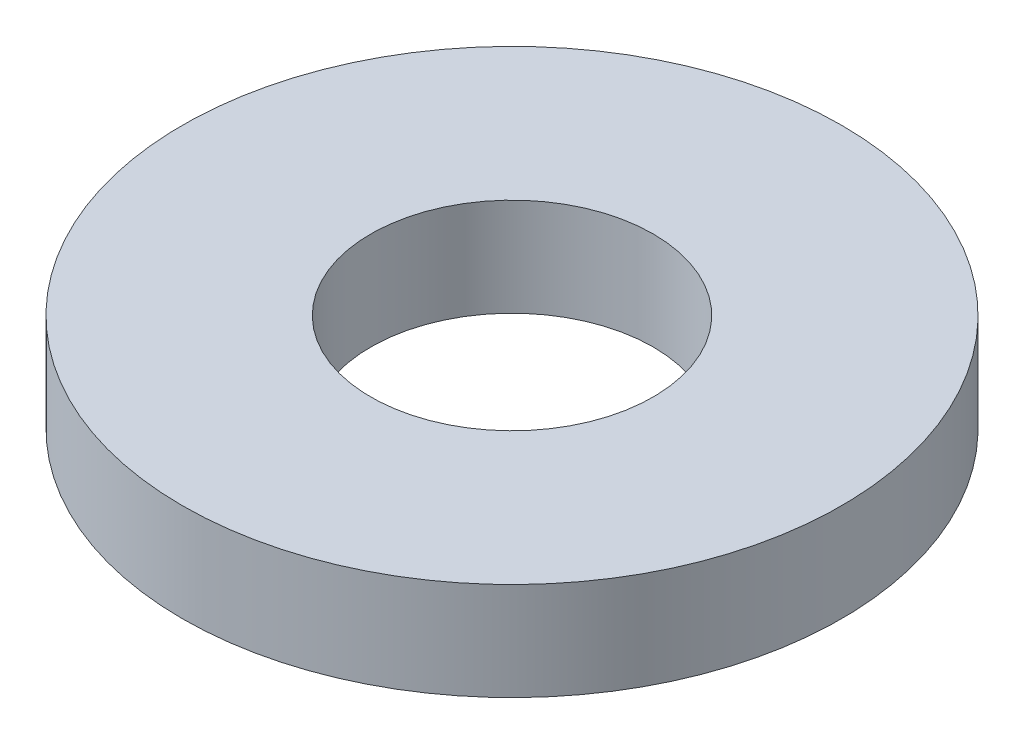
ISO-10303-21;
HEADER;
FILE_DESCRIPTION(('STEP AP214'),'2;1');
FILE_NAME('part.step','',(''),(''),'','','');
FILE_SCHEMA(('AUTOMOTIVE_DESIGN { 1 0 10303 214 1 1 1 1 }'));
ENDSEC;
DATA;
#1=APPLICATION_CONTEXT('core data for automotive mechanical design processes');
#2=APPLICATION_PROTOCOL_DEFINITION('international standard','automotive_design',2000,#1);
#3=PRODUCT_CONTEXT('',#1,'mechanical');
#4=PRODUCT('Part','Part','',(#3));
#5=PRODUCT_RELATED_PRODUCT_CATEGORY('part','',(#4));
#6=PRODUCT_DEFINITION_FORMATION('','',#4);
#7=PRODUCT_DEFINITION_CONTEXT('part definition',#1,'design');
#8=PRODUCT_DEFINITION('design','',#6,#7);
#9=PRODUCT_DEFINITION_SHAPE('','',#8);
#10=(LENGTH_UNIT() NAMED_UNIT(*) SI_UNIT(.MILLI.,.METRE.));
#11=(NAMED_UNIT(*) PLANE_ANGLE_UNIT() SI_UNIT($,.RADIAN.));
#12=(NAMED_UNIT(*) SI_UNIT($,.STERADIAN.) SOLID_ANGLE_UNIT());
#13=UNCERTAINTY_MEASURE_WITH_UNIT(LENGTH_MEASURE(1.E-05),#10,'distance_accuracy_value','');
#14=(GEOMETRIC_REPRESENTATION_CONTEXT(3) GLOBAL_UNCERTAINTY_ASSIGNED_CONTEXT((#13)) GLOBAL_UNIT_ASSIGNED_CONTEXT((#10,
#11,#12)) REPRESENTATION_CONTEXT('',''));
#15=CARTESIAN_POINT('',(0.,0.,0.));
#16=DIRECTION('',(0.,0.,1.));
#17=DIRECTION('',(1.,0.,0.));
#18=AXIS2_PLACEMENT_3D('',#15,#16,#17);
#19=CARTESIAN_POINT('',(0.,0.8255,0.));
#20=DIRECTION('',(0.,1.,0.));
#21=DIRECTION('',(0.,0.,1.));
#22=AXIS2_PLACEMENT_3D('',#19,#20,#21);
#23=PLANE('',#22);
#24=CARTESIAN_POINT('',(0.,0.8255,0.));
#25=DIRECTION('',(0.,1.,0.));
#26=DIRECTION('',(0.,0.,1.));
#27=AXIS2_PLACEMENT_3D('',#24,#25,#26);
#28=CIRCLE('',#27,5.55625);
#29=CARTESIAN_POINT('',(0.,0.8255,-5.55625));
#30=VERTEX_POINT('',#29);
#31=EDGE_CURVE('E10',#30,#30,#28,.T.);
#32=ORIENTED_EDGE('',*,*,#31,.T.);
#33=EDGE_LOOP('',(#32));
#34=FACE_BOUND('',#33,.T.);
#35=CARTESIAN_POINT('',(0.,0.8255,0.));
#36=DIRECTION('',(0.,1.,0.));
#37=DIRECTION('',(0.,0.,1.));
#38=AXIS2_PLACEMENT_3D('',#35,#36,#37);
#39=CIRCLE('',#38,2.38125);
#40=CARTESIAN_POINT('',(0.,0.8255,-2.38125));
#41=VERTEX_POINT('',#40);
#42=EDGE_CURVE('E40',#41,#41,#39,.T.);
#43=ORIENTED_EDGE('',*,*,#42,.F.);
#44=EDGE_LOOP('',(#43));
#45=FACE_BOUND('',#44,.T.);
#46=ADVANCED_FACE('F33',(#34,#45),#23,.T.);
#47=CARTESIAN_POINT('',(0.,0.8255,0.));
#48=DIRECTION('',(0.,-1.,0.));
#49=DIRECTION('',(0.,0.,-1.));
#50=AXIS2_PLACEMENT_3D('',#47,#48,#49);
#51=CYLINDRICAL_SURFACE('',#50,5.55625);
#52=CARTESIAN_POINT('',(0.,-0.8255,0.));
#53=DIRECTION('',(0.,1.,0.));
#54=DIRECTION('',(0.,0.,1.));
#55=AXIS2_PLACEMENT_3D('',#52,#53,#54);
#56=CIRCLE('',#55,5.55625);
#57=CARTESIAN_POINT('',(0.,-0.8255,-5.55625));
#58=VERTEX_POINT('',#57);
#59=EDGE_CURVE('E44',#58,#58,#56,.T.);
#60=CARTESIAN_POINT('',(0.,0.8255,-5.55625));
#61=CARTESIAN_POINT('',(0.,0.808302083333333,-5.55625));
#62=CARTESIAN_POINT('',(0.,0.791104166666666,-5.55625));
#63=CARTESIAN_POINT('',(0.,0.756708333333333,-5.55625));
#64=CARTESIAN_POINT('',(0.,0.739510416666667,-5.55625));
#65=CARTESIAN_POINT('',(0.,0.705114583333333,-5.55625));
#66=CARTESIAN_POINT('',(0.,0.687916666666667,-5.55625));
#67=CARTESIAN_POINT('',(0.,0.653520833333333,-5.55625));
#68=CARTESIAN_POINT('',(0.,0.636322916666667,-5.55625));
#69=CARTESIAN_POINT('',(0.,0.601927083333333,-5.55625));
#70=CARTESIAN_POINT('',(0.,0.584729166666667,-5.55625));
#71=CARTESIAN_POINT('',(0.,0.550333333333333,-5.55625));
#72=CARTESIAN_POINT('',(0.,0.533135416666667,-5.55625));
#73=CARTESIAN_POINT('',(0.,0.498739583333333,-5.55625));
#74=CARTESIAN_POINT('',(0.,0.481541666666667,-5.55625));
#75=CARTESIAN_POINT('',(0.,0.447145833333333,-5.55625));
#76=CARTESIAN_POINT('',(0.,0.429947916666667,-5.55625));
#77=CARTESIAN_POINT('',(0.,0.395552083333333,-5.55625));
#78=CARTESIAN_POINT('',(0.,0.378354166666667,-5.55625));
#79=CARTESIAN_POINT('',(0.,0.343958333333333,-5.55625));
#80=CARTESIAN_POINT('',(0.,0.326760416666667,-5.55625));
#81=CARTESIAN_POINT('',(0.,0.292364583333333,-5.55625));
#82=CARTESIAN_POINT('',(0.,0.275166666666667,-5.55625));
#83=CARTESIAN_POINT('',(0.,0.240770833333333,-5.55625));
#84=CARTESIAN_POINT('',(0.,0.223572916666667,-5.55625));
#85=CARTESIAN_POINT('',(0.,0.189177083333333,-5.55625));
#86=CARTESIAN_POINT('',(0.,0.171979166666667,-5.55625));
#87=CARTESIAN_POINT('',(0.,0.137583333333333,-5.55625));
#88=CARTESIAN_POINT('',(0.,0.120385416666667,-5.55625));
#89=CARTESIAN_POINT('',(0.,0.0859895833333332,-5.55625));
#90=CARTESIAN_POINT('',(0.,0.0687916666666665,-5.55625));
#91=CARTESIAN_POINT('',(0.,0.0343958333333332,-5.55625));
#92=CARTESIAN_POINT('',(0.,0.0171979166666666,-5.55625));
#93=CARTESIAN_POINT('',(0.,-0.0171979166666668,-5.55625));
#94=CARTESIAN_POINT('',(0.,-0.0343958333333334,-5.55625));
#95=CARTESIAN_POINT('',(0.,-0.0687916666666668,-5.55625));
#96=CARTESIAN_POINT('',(0.,-0.0859895833333334,-5.55625));
#97=CARTESIAN_POINT('',(0.,-0.120385416666667,-5.55625));
#98=CARTESIAN_POINT('',(0.,-0.137583333333333,-5.55625));
#99=CARTESIAN_POINT('',(0.,-0.171979166666667,-5.55625));
#100=CARTESIAN_POINT('',(0.,-0.189177083333333,-5.55625));
#101=CARTESIAN_POINT('',(0.,-0.223572916666667,-5.55625));
#102=CARTESIAN_POINT('',(0.,-0.240770833333333,-5.55625));
#103=CARTESIAN_POINT('',(0.,-0.275166666666667,-5.55625));
#104=CARTESIAN_POINT('',(0.,-0.292364583333333,-5.55625));
#105=CARTESIAN_POINT('',(0.,-0.326760416666666,-5.55625));
#106=CARTESIAN_POINT('',(0.,-0.343958333333333,-5.55625));
#107=CARTESIAN_POINT('',(0.,-0.378354166666667,-5.55625));
#108=CARTESIAN_POINT('',(0.,-0.395552083333333,-5.55625));
#109=CARTESIAN_POINT('',(0.,-0.429947916666667,-5.55625));
#110=CARTESIAN_POINT('',(0.,-0.447145833333333,-5.55625));
#111=CARTESIAN_POINT('',(0.,-0.481541666666667,-5.55625));
#112=CARTESIAN_POINT('',(0.,-0.498739583333333,-5.55625));
#113=CARTESIAN_POINT('',(0.,-0.533135416666667,-5.55625));
#114=CARTESIAN_POINT('',(0.,-0.550333333333333,-5.55625));
#115=CARTESIAN_POINT('',(0.,-0.584729166666667,-5.55625));
#116=CARTESIAN_POINT('',(0.,-0.601927083333333,-5.55625));
#117=CARTESIAN_POINT('',(0.,-0.636322916666667,-5.55625));
#118=CARTESIAN_POINT('',(0.,-0.653520833333333,-5.55625));
#119=CARTESIAN_POINT('',(0.,-0.687916666666667,-5.55625));
#120=CARTESIAN_POINT('',(0.,-0.705114583333333,-5.55625));
#121=CARTESIAN_POINT('',(0.,-0.739510416666667,-5.55625));
#122=CARTESIAN_POINT('',(0.,-0.756708333333333,-5.55625));
#123=CARTESIAN_POINT('',(0.,-0.791104166666667,-5.55625));
#124=CARTESIAN_POINT('',(0.,-0.808302083333333,-5.55625));
#125=CARTESIAN_POINT('',(0.,-0.8255,-5.55625));
#126=B_SPLINE_CURVE_WITH_KNOTS('',3,(#60,#61,#62,#63,#64,#65,#66,#67,#68,#69,#70,#71,#72,#73,
#74,#75,#76,#77,#78,#79,#80,#81,#82,#83,#84,#85,#86,#87,#88,#89,#90,#91,#92,#93,#94,#95,#96,#97,
#98,#99,#100,#101,#102,#103,#104,#105,#106,#107,#108,#109,#110,#111,#112,#113,#114,#115,#116,
#117,#118,#119,#120,#121,#122,#123,#124,#125),.UNSPECIFIED.,.F.,.F.,(4,2,2,2,2,2,2,2,2,2,2,2,2,
2,2,2,2,2,2,2,2,2,2,2,2,2,2,2,2,2,2,2,4),(0.,0.05159375,0.1031875,0.15478125,0.206375,
0.25796875,0.3095625,0.36115625,0.41275,0.46434375,0.5159375,0.56753125,0.619125,0.67071875,
0.7223125,0.77390625,0.8255,0.87709375,0.9286875,0.98028125,1.031875,1.08346875,1.1350625,
1.18665625,1.23825,1.28984375,1.3414375,1.39303125,1.444625,1.49621875,1.5478125,1.59940625,
1.651),.UNSPECIFIED.);
#127=EDGE_CURVE('BSEAM35',#30,#58,#126,.T.);
#128=ORIENTED_EDGE('',*,*,#31,.F.);
#129=ORIENTED_EDGE('',*,*,#59,.T.);
#130=ORIENTED_EDGE('',*,*,#127,.T.);
#131=ORIENTED_EDGE('',*,*,#127,.F.);
#132=EDGE_LOOP('',(#128,#130,#129,#131));
#133=FACE_BOUND('',#132,.T.);
#134=ADVANCED_FACE('F35',(#133),#51,.T.);
#135=CARTESIAN_POINT('',(0.,0.8255,0.));
#136=DIRECTION('',(0.,-1.,0.));
#137=DIRECTION('',(0.,0.,-1.));
#138=AXIS2_PLACEMENT_3D('',#135,#136,#137);
#139=CYLINDRICAL_SURFACE('',#138,2.38125);
#140=CARTESIAN_POINT('',(0.,-0.8255,0.));
#141=DIRECTION('',(0.,1.,0.));
#142=DIRECTION('',(0.,0.,1.));
#143=AXIS2_PLACEMENT_3D('',#140,#141,#142);
#144=CIRCLE('',#143,2.38125);
#145=CARTESIAN_POINT('',(0.,-0.8255,-2.38125));
#146=VERTEX_POINT('',#145);
#147=EDGE_CURVE('E48',#146,#146,#144,.T.);
#148=CARTESIAN_POINT('',(0.,0.8255,-2.38125));
#149=CARTESIAN_POINT('',(0.,0.808302083333333,-2.38125));
#150=CARTESIAN_POINT('',(0.,0.791104166666666,-2.38125));
#151=CARTESIAN_POINT('',(0.,0.756708333333333,-2.38125));
#152=CARTESIAN_POINT('',(0.,0.739510416666667,-2.38125));
#153=CARTESIAN_POINT('',(0.,0.705114583333333,-2.38125));
#154=CARTESIAN_POINT('',(0.,0.687916666666667,-2.38125));
#155=CARTESIAN_POINT('',(0.,0.653520833333333,-2.38125));
#156=CARTESIAN_POINT('',(0.,0.636322916666667,-2.38125));
#157=CARTESIAN_POINT('',(0.,0.601927083333333,-2.38125));
#158=CARTESIAN_POINT('',(0.,0.584729166666667,-2.38125));
#159=CARTESIAN_POINT('',(0.,0.550333333333333,-2.38125));
#160=CARTESIAN_POINT('',(0.,0.533135416666667,-2.38125));
#161=CARTESIAN_POINT('',(0.,0.498739583333333,-2.38125));
#162=CARTESIAN_POINT('',(0.,0.481541666666667,-2.38125));
#163=CARTESIAN_POINT('',(0.,0.447145833333333,-2.38125));
#164=CARTESIAN_POINT('',(0.,0.429947916666667,-2.38125));
#165=CARTESIAN_POINT('',(0.,0.395552083333333,-2.38125));
#166=CARTESIAN_POINT('',(0.,0.378354166666667,-2.38125));
#167=CARTESIAN_POINT('',(0.,0.343958333333333,-2.38125));
#168=CARTESIAN_POINT('',(0.,0.326760416666667,-2.38125));
#169=CARTESIAN_POINT('',(0.,0.292364583333333,-2.38125));
#170=CARTESIAN_POINT('',(0.,0.275166666666667,-2.38125));
#171=CARTESIAN_POINT('',(0.,0.240770833333333,-2.38125));
#172=CARTESIAN_POINT('',(0.,0.223572916666667,-2.38125));
#173=CARTESIAN_POINT('',(0.,0.189177083333333,-2.38125));
#174=CARTESIAN_POINT('',(0.,0.171979166666667,-2.38125));
#175=CARTESIAN_POINT('',(0.,0.137583333333333,-2.38125));
#176=CARTESIAN_POINT('',(0.,0.120385416666667,-2.38125));
#177=CARTESIAN_POINT('',(0.,0.0859895833333333,-2.38125));
#178=CARTESIAN_POINT('',(0.,0.0687916666666667,-2.38125));
#179=CARTESIAN_POINT('',(0.,0.0343958333333333,-2.38125));
#180=CARTESIAN_POINT('',(0.,0.0171979166666667,-2.38125));
#181=CARTESIAN_POINT('',(0.,-0.0171979166666667,-2.38125));
#182=CARTESIAN_POINT('',(0.,-0.0343958333333333,-2.38125));
#183=CARTESIAN_POINT('',(0.,-0.0687916666666667,-2.38125));
#184=CARTESIAN_POINT('',(0.,-0.0859895833333333,-2.38125));
#185=CARTESIAN_POINT('',(0.,-0.120385416666667,-2.38125));
#186=CARTESIAN_POINT('',(0.,-0.137583333333333,-2.38125));
#187=CARTESIAN_POINT('',(0.,-0.171979166666667,-2.38125));
#188=CARTESIAN_POINT('',(0.,-0.189177083333333,-2.38125));
#189=CARTESIAN_POINT('',(0.,-0.223572916666667,-2.38125));
#190=CARTESIAN_POINT('',(0.,-0.240770833333333,-2.38125));
#191=CARTESIAN_POINT('',(0.,-0.275166666666667,-2.38125));
#192=CARTESIAN_POINT('',(0.,-0.292364583333333,-2.38125));
#193=CARTESIAN_POINT('',(0.,-0.326760416666666,-2.38125));
#194=CARTESIAN_POINT('',(0.,-0.343958333333333,-2.38125));
#195=CARTESIAN_POINT('',(0.,-0.378354166666667,-2.38125));
#196=CARTESIAN_POINT('',(0.,-0.395552083333333,-2.38125));
#197=CARTESIAN_POINT('',(0.,-0.429947916666667,-2.38125));
#198=CARTESIAN_POINT('',(0.,-0.447145833333333,-2.38125));
#199=CARTESIAN_POINT('',(0.,-0.481541666666667,-2.38125));
#200=CARTESIAN_POINT('',(0.,-0.498739583333333,-2.38125));
#201=CARTESIAN_POINT('',(0.,-0.533135416666667,-2.38125));
#202=CARTESIAN_POINT('',(0.,-0.550333333333333,-2.38125));
#203=CARTESIAN_POINT('',(0.,-0.584729166666667,-2.38125));
#204=CARTESIAN_POINT('',(0.,-0.601927083333333,-2.38125));
#205=CARTESIAN_POINT('',(0.,-0.636322916666667,-2.38125));
#206=CARTESIAN_POINT('',(0.,-0.653520833333333,-2.38125));
#207=CARTESIAN_POINT('',(0.,-0.687916666666667,-2.38125));
#208=CARTESIAN_POINT('',(0.,-0.705114583333333,-2.38125));
#209=CARTESIAN_POINT('',(0.,-0.739510416666667,-2.38125));
#210=CARTESIAN_POINT('',(0.,-0.756708333333333,-2.38125));
#211=CARTESIAN_POINT('',(0.,-0.791104166666667,-2.38125));
#212=CARTESIAN_POINT('',(0.,-0.808302083333333,-2.38125));
#213=CARTESIAN_POINT('',(0.,-0.8255,-2.38125));
#214=B_SPLINE_CURVE_WITH_KNOTS('',3,(#148,#149,#150,#151,#152,#153,#154,#155,#156,#157,#158,
#159,#160,#161,#162,#163,#164,#165,#166,#167,#168,#169,#170,#171,#172,#173,#174,#175,#176,#177,
#178,#179,#180,#181,#182,#183,#184,#185,#186,#187,#188,#189,#190,#191,#192,#193,#194,#195,#196,
#197,#198,#199,#200,#201,#202,#203,#204,#205,#206,#207,#208,#209,#210,#211,#212,#213),
.UNSPECIFIED.,.F.,.F.,(4,2,2,2,2,2,2,2,2,2,2,2,2,2,2,2,2,2,2,2,2,2,2,2,2,2,2,2,2,2,2,2,4),(0.,
0.0515937500000001,0.1031875,0.15478125,0.206375,0.25796875,0.3095625,0.36115625,0.41275,
0.46434375,0.5159375,0.56753125,0.619125,0.67071875,0.7223125,0.77390625,0.8255,0.87709375,
0.9286875,0.98028125,1.031875,1.08346875,1.1350625,1.18665625,1.23825,1.28984375,1.3414375,
1.39303125,1.444625,1.49621875,1.5478125,1.59940625,1.651),.UNSPECIFIED.);
#215=EDGE_CURVE('BSEAM57',#41,#146,#214,.T.);
#216=ORIENTED_EDGE('',*,*,#42,.T.);
#217=ORIENTED_EDGE('',*,*,#147,.F.);
#218=ORIENTED_EDGE('',*,*,#215,.T.);
#219=ORIENTED_EDGE('',*,*,#215,.F.);
#220=EDGE_LOOP('',(#216,#218,#217,#219));
#221=FACE_BOUND('',#220,.T.);
#222=ADVANCED_FACE('F57',(#221),#139,.F.);
#223=CARTESIAN_POINT('',(0.,-0.8255,0.));
#224=DIRECTION('',(0.,1.,0.));
#225=DIRECTION('',(0.,0.,1.));
#226=AXIS2_PLACEMENT_3D('',#223,#224,#225);
#227=PLANE('',#226);
#228=ORIENTED_EDGE('',*,*,#147,.T.);
#229=EDGE_LOOP('',(#228));
#230=FACE_BOUND('',#229,.T.);
#231=ORIENTED_EDGE('',*,*,#59,.F.);
#232=EDGE_LOOP('',(#231));
#233=FACE_BOUND('',#232,.T.);
#234=ADVANCED_FACE('F54',(#230,#233),#227,.F.);
#235=CLOSED_SHELL('',(#46,#134,#222,#234));
#236=MANIFOLD_SOLID_BREP('B2',#235);
#237=ADVANCED_BREP_SHAPE_REPRESENTATION('',(#18,#236),#14);
#238=SHAPE_DEFINITION_REPRESENTATION(#9,#237);
ENDSEC;
END-ISO-10303-21;
